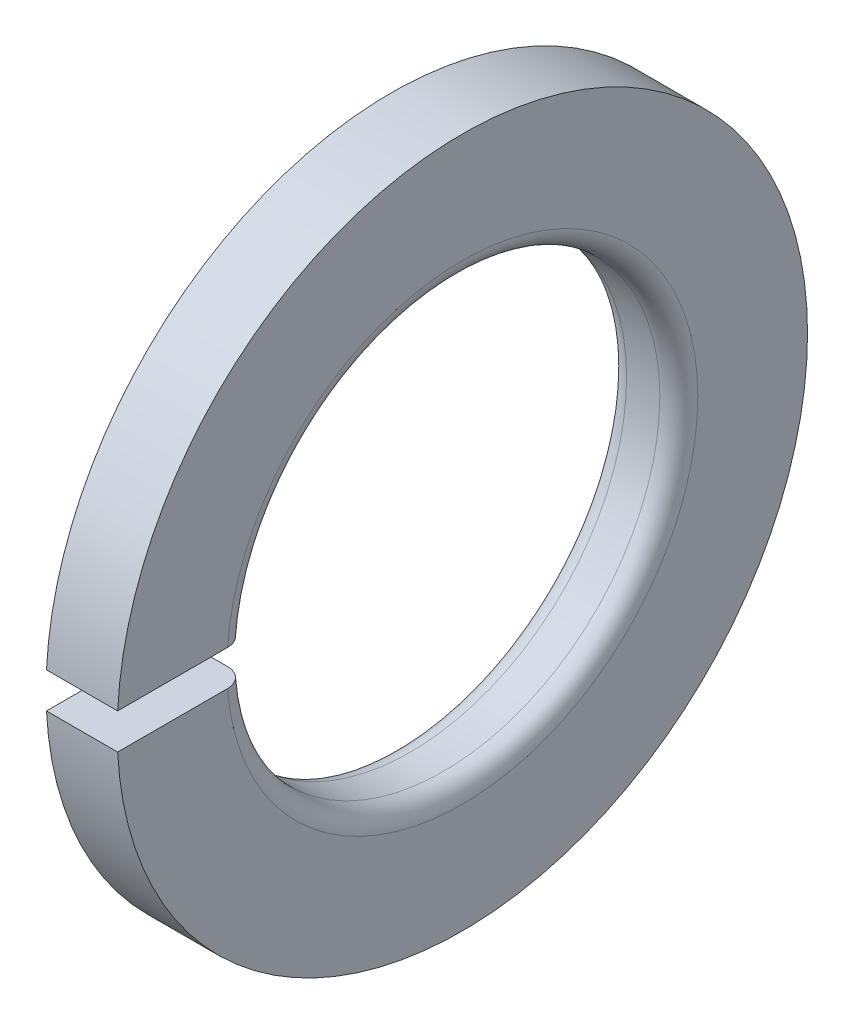
ISO-10303-21;
HEADER;
FILE_DESCRIPTION(('STEP AP214'),'2;1');
FILE_NAME('part.step','',(''),(''),'','','');
FILE_SCHEMA(('AUTOMOTIVE_DESIGN { 1 0 10303 214 1 1 1 1 }'));
ENDSEC;
DATA;
#1=APPLICATION_CONTEXT('core data for automotive mechanical design processes');
#2=APPLICATION_PROTOCOL_DEFINITION('international standard','automotive_design',2000,#1);
#3=PRODUCT_CONTEXT('',#1,'mechanical');
#4=PRODUCT('Part','Part','',(#3));
#5=PRODUCT_RELATED_PRODUCT_CATEGORY('part','',(#4));
#6=PRODUCT_DEFINITION_FORMATION('','',#4);
#7=PRODUCT_DEFINITION_CONTEXT('part definition',#1,'design');
#8=PRODUCT_DEFINITION('design','',#6,#7);
#9=PRODUCT_DEFINITION_SHAPE('','',#8);
#10=(LENGTH_UNIT() NAMED_UNIT(*) SI_UNIT(.MILLI.,.METRE.));
#11=(NAMED_UNIT(*) PLANE_ANGLE_UNIT() SI_UNIT($,.RADIAN.));
#12=(NAMED_UNIT(*) SI_UNIT($,.STERADIAN.) SOLID_ANGLE_UNIT());
#13=UNCERTAINTY_MEASURE_WITH_UNIT(LENGTH_MEASURE(1.E-05),#10,'distance_accuracy_value','');
#14=(GEOMETRIC_REPRESENTATION_CONTEXT(3) GLOBAL_UNCERTAINTY_ASSIGNED_CONTEXT((#13)) GLOBAL_UNIT_ASSIGNED_CONTEXT((#10,
#11,#12)) REPRESENTATION_CONTEXT('',''));
#15=CARTESIAN_POINT('',(0.,0.,0.));
#16=DIRECTION('',(0.,0.,1.));
#17=DIRECTION('',(1.,0.,0.));
#18=AXIS2_PLACEMENT_3D('',#15,#16,#17);
#19=CARTESIAN_POINT('',(-34.9249999999999,0.,0.));
#20=DIRECTION('',(-1.,0.,0.));
#21=DIRECTION('',(0.,0.,1.));
#22=AXIS2_PLACEMENT_3D('',#19,#20,#21);
#23=CYLINDRICAL_SURFACE('',#22,29.1);
#24=DIRECTION('',(-1.,0.,0.));
#25=VECTOR('',#24,1.);
#26=CARTESIAN_POINT('',(-34.9249999999999,1.5,29.0613144919496));
#27=LINE('',#26,#25);
#28=CARTESIAN_POINT('',(0.,1.5,29.0613144919496));
#29=VERTEX_POINT('',#28);
#30=CARTESIAN_POINT('',(-6.,1.5,29.0613144919496));
#31=VERTEX_POINT('',#30);
#32=EDGE_CURVE('E45',#29,#31,#27,.T.);
#33=ORIENTED_EDGE('',*,*,#32,.F.);
#34=CARTESIAN_POINT('',(0.,0.,0.));
#35=DIRECTION('',(-1.,0.,0.));
#36=DIRECTION('',(0.,0.,1.));
#37=AXIS2_PLACEMENT_3D('',#34,#35,#36);
#38=CIRCLE('',#37,29.1);
#39=CARTESIAN_POINT('',(0.,-1.5,29.0613144919496));
#40=VERTEX_POINT('',#39);
#41=EDGE_CURVE('E106',#29,#40,#38,.T.);
#42=ORIENTED_EDGE('',*,*,#41,.T.);
#43=DIRECTION('',(-1.,0.,0.));
#44=VECTOR('',#43,1.);
#45=CARTESIAN_POINT('',(-34.9249999999999,-1.5,29.0613144919496));
#46=LINE('',#45,#44);
#47=CARTESIAN_POINT('',(-6.,-1.5,29.0613144919496));
#48=VERTEX_POINT('',#47);
#49=EDGE_CURVE('E87',#48,#40,#46,.F.);
#50=ORIENTED_EDGE('',*,*,#49,.F.);
#51=CARTESIAN_POINT('',(-6.,0.,0.));
#52=DIRECTION('',(-1.,0.,0.));
#53=DIRECTION('',(0.,0.,1.));
#54=AXIS2_PLACEMENT_3D('',#51,#52,#53);
#55=CIRCLE('',#54,29.1);
#56=EDGE_CURVE('E118',#31,#48,#55,.T.);
#57=ORIENTED_EDGE('',*,*,#56,.F.);
#58=EDGE_LOOP('',(#33,#42,#50,#57));
#59=FACE_BOUND('',#58,.T.);
#60=ADVANCED_FACE('F32',(#59),#23,.T.);
#61=CARTESIAN_POINT('',(0.,19.85,0.));
#62=DIRECTION('',(-1.,0.,0.));
#63=DIRECTION('',(0.,0.,1.));
#64=AXIS2_PLACEMENT_3D('',#61,#62,#63);
#65=PLANE('',#64);
#66=DIRECTION('',(0.,0.,-1.));
#67=VECTOR('',#66,1.);
#68=CARTESIAN_POINT('',(0.,1.5,29.682));
#69=LINE('',#68,#67);
#70=CARTESIAN_POINT('',(0.,1.5,19.7932437968111));
#71=VERTEX_POINT('',#70);
#72=EDGE_CURVE('E92',#29,#71,#69,.T.);
#73=ORIENTED_EDGE('',*,*,#72,.T.);
#74=CARTESIAN_POINT('',(0.,0.,0.));
#75=DIRECTION('',(-1.,0.,0.));
#76=DIRECTION('',(0.,0.,1.));
#77=AXIS2_PLACEMENT_3D('',#74,#75,#76);
#78=CIRCLE('',#77,19.85);
#79=CARTESIAN_POINT('',(0.,-1.5,19.7932437968111));
#80=VERTEX_POINT('',#79);
#81=EDGE_CURVE('E99',#71,#80,#78,.T.);
#82=ORIENTED_EDGE('',*,*,#81,.T.);
#83=DIRECTION('',(0.,0.,1.));
#84=VECTOR('',#83,1.);
#85=CARTESIAN_POINT('',(0.,-1.5,0.));
#86=LINE('',#85,#84);
#87=EDGE_CURVE('E81',#80,#40,#86,.T.);
#88=ORIENTED_EDGE('',*,*,#87,.T.);
#89=ORIENTED_EDGE('',*,*,#41,.F.);
#90=EDGE_LOOP('',(#73,#82,#88,#89));
#91=FACE_BOUND('',#90,.T.);
#92=ADVANCED_FACE('F105',(#91),#65,.F.);
#93=CARTESIAN_POINT('',(-1.6,0.,0.));
#94=DIRECTION('',(-1.,0.,0.));
#95=DIRECTION('',(0.,0.,1.));
#96=AXIS2_PLACEMENT_3D('',#93,#94,#95);
#97=TOROIDAL_SURFACE('',#96,19.85,1.6);
#98=ORIENTED_EDGE('',*,*,#81,.F.);
#99=CARTESIAN_POINT('',(-1.35898862941232,1.5,18.2065697970712));
#100=CARTESIAN_POINT('',(-1.44756264219889,1.5,18.1930320440047));
#101=CARTESIAN_POINT('',(-1.53734436705855,1.5,18.1869657742528));
#102=CARTESIAN_POINT('',(-1.71672508267117,1.5,18.1899960073179));
#103=CARTESIAN_POINT('',(-1.80632372802799,1.5,18.1991105931413));
#104=CARTESIAN_POINT('',(-1.98267978527209,1.5,18.2322522732383));
#105=CARTESIAN_POINT('',(-2.06943862751872,1.5,18.2562717346096));
#106=CARTESIAN_POINT('',(-2.23767395505805,1.5,18.3185162662278));
#107=CARTESIAN_POINT('',(-2.31915170666891,1.5,18.356737916115));
#108=CARTESIAN_POINT('',(-2.47463573194463,1.5,18.4463332782058));
#109=CARTESIAN_POINT('',(-2.54863414894016,1.5,18.4977206241443));
#110=CARTESIAN_POINT('',(-2.68698778072629,1.5,18.6121581582613));
#111=CARTESIAN_POINT('',(-2.75134249542695,1.5,18.6752089508883));
#112=CARTESIAN_POINT('',(-2.86877662072559,1.5,18.8113725098221));
#113=CARTESIAN_POINT('',(-2.92182337797574,1.5,18.8845134372985));
#114=CARTESIAN_POINT('',(-3.01492839338455,1.5,19.0386410098248));
#115=CARTESIAN_POINT('',(-3.0549864516518,1.5,19.1196277755945));
#116=CARTESIAN_POINT('',(-3.12109977190569,1.5,19.2874120717265));
#117=CARTESIAN_POINT('',(-3.14711232451801,1.5,19.3742264327302));
#118=CARTESIAN_POINT('',(-3.18422209141426,1.5,19.5509866443176));
#119=CARTESIAN_POINT('',(-3.19531915789572,1.5,19.6409325259236));
#120=CARTESIAN_POINT('',(-3.20229183118463,1.5,19.8215710344792));
#121=CARTESIAN_POINT('',(-3.19814073119644,1.5,19.9122646937714));
#122=CARTESIAN_POINT('',(-3.17466942665468,1.5,20.091668060745));
#123=CARTESIAN_POINT('',(-3.1553491780564,1.5,20.1803777626651));
#124=CARTESIAN_POINT('',(-3.10208087640931,1.5,20.3532768185581));
#125=CARTESIAN_POINT('',(-3.06813506328876,1.5,20.4374668625043));
#126=CARTESIAN_POINT('',(-2.9865665247085,1.5,20.5989385297249));
#127=CARTESIAN_POINT('',(-2.93894390974055,1.5,20.676220208804));
#128=CARTESIAN_POINT('',(-2.83145952958272,1.5,20.8215313866775));
#129=CARTESIAN_POINT('',(-2.77161962727461,1.5,20.8895770561764));
#130=CARTESIAN_POINT('',(-2.64133933557313,1.5,21.014624888216));
#131=CARTESIAN_POINT('',(-2.57089908394285,1.5,21.0716271942552));
#132=CARTESIAN_POINT('',(-2.42160768621288,1.5,21.1728176319717));
#133=CARTESIAN_POINT('',(-2.34277815834402,1.5,21.2170376583009));
#134=CARTESIAN_POINT('',(-2.17880174150641,1.5,21.2915813400076));
#135=CARTESIAN_POINT('',(-2.09365493574573,1.5,21.3219051783811));
#136=CARTESIAN_POINT('',(-1.9196662955211,1.5,21.3677292166293));
#137=CARTESIAN_POINT('',(-1.83083316821152,1.5,21.3832624803174));
#138=CARTESIAN_POINT('',(-1.65182011224298,1.5,21.3991754498783));
#139=CARTESIAN_POINT('',(-1.5616401948385,1.5,21.3995552823101));
#140=CARTESIAN_POINT('',(-1.38260446434317,1.5,21.38515912134));
#141=CARTESIAN_POINT('',(-1.29374723391222,1.5,21.3704007452365));
#142=CARTESIAN_POINT('',(-1.11977076978006,1.5,21.326179749964));
#143=CARTESIAN_POINT('',(-1.0346515322168,1.5,21.2967171459877));
#144=CARTESIAN_POINT('',(-0.87053613982388,1.5,21.2239224595834));
#145=CARTESIAN_POINT('',(-0.791541834195377,1.5,21.1805862086086));
#146=CARTESIAN_POINT('',(-0.641934076647546,1.5,21.0812876423963));
#147=CARTESIAN_POINT('',(-0.57132068604379,1.5,21.0253252347933));
#148=CARTESIAN_POINT('',(-0.440349901223056,1.5,20.9022674852953));
#149=CARTESIAN_POINT('',(-0.38000975893144,1.5,20.8351537831413));
#150=CARTESIAN_POINT('',(-0.271420338049165,1.5,20.6917701667164));
#151=CARTESIAN_POINT('',(-0.22317119834632,1.5,20.6155001472828));
#152=CARTESIAN_POINT('',(-0.140006443732164,1.5,20.4557686412415));
#153=CARTESIAN_POINT('',(-0.105123913631718,1.5,20.3722899290199));
#154=CARTESIAN_POINT('',(-0.0498316399833283,1.5,20.2006695798564));
#155=CARTESIAN_POINT('',(-0.029422123933152,1.5,20.1125278696414));
#156=CARTESIAN_POINT('',(-0.00361029931817148,1.5,19.9338623377287));
#157=CARTESIAN_POINT('',(0.00175670724642623,1.5,19.8433334149511));
#158=CARTESIAN_POINT('',(-0.00276354879845688,1.5,19.6626566676938));
#159=CARTESIAN_POINT('',(-0.0126509853949023,1.5,19.5725088475725));
#160=CARTESIAN_POINT('',(-0.0474234873886119,1.5,19.3950362522409));
#161=CARTESIAN_POINT('',(-0.0723272144995143,1.5,19.3077151324688));
#162=CARTESIAN_POINT('',(-0.136448616705549,1.5,19.1384998728598));
#163=CARTESIAN_POINT('',(-0.175665733574809,1.5,19.0566055215247));
#164=CARTESIAN_POINT('',(-0.267279982419321,1.5,18.9006318707112));
#165=CARTESIAN_POINT('',(-0.319667817885635,1.5,18.8265471109892));
#166=CARTESIAN_POINT('',(-0.43618078430084,1.5,18.6882315830034));
#167=CARTESIAN_POINT('',(-0.500308705570106,1.5,18.6240031640269));
#168=CARTESIAN_POINT('',(-0.638334807094057,1.5,18.5073897056886));
#169=CARTESIAN_POINT('',(-0.71221416670987,1.5,18.4549823660662));
#170=CARTESIAN_POINT('',(-0.867689377618268,1.5,18.3634172873524));
#171=CARTESIAN_POINT('',(-0.949275652140454,1.5,18.3242433742089));
#172=CARTESIAN_POINT('',(-1.0860658761961,1.5,18.2722771118594));
#173=CARTESIAN_POINT('',(-1.13964885389551,1.5,18.2551041086582));
#174=CARTESIAN_POINT('',(-1.24832564735517,1.5,18.2264970835713));
#175=CARTESIAN_POINT('',(-1.30341946060914,1.5,18.215063052166));
#176=CARTESIAN_POINT('',(-1.35898862941232,1.5,18.2065697970712));
#177=B_SPLINE_CURVE_WITH_KNOTS('',3,(#99,#100,#101,#102,#103,#104,#105,#106,#107,#108,#109,#110,
#111,#112,#113,#114,#115,#116,#117,#118,#119,#120,#121,#122,#123,#124,#125,#126,#127,#128,#129,
#130,#131,#132,#133,#134,#135,#136,#137,#138,#139,#140,#141,#142,#143,#144,#145,#146,#147,#148,
#149,#150,#151,#152,#153,#154,#155,#156,#157,#158,#159,#160,#161,#162,#163,#164,#165,#166,#167,
#168,#169,#170,#171,#172,#173,#174,#175,#176),.UNSPECIFIED.,.T.,.F.,(4,2,2,2,2,2,2,2,2,2,2,2,2,
2,2,2,2,2,2,2,2,2,2,2,2,2,2,2,2,2,2,2,2,2,2,2,2,2,4),(0.,0.268602518172523,0.537525216954459,
0.806310311862341,1.07503071628382,1.34403052683165,1.61304428198022,1.8828246341334,
2.15260913791189,2.42320944359887,2.69381243073406,2.96488959828007,3.23596755292079,
3.50700400629479,3.77803827008875,4.04859170255715,4.31914161919272,4.58901050767115,
4.85887584220014,5.12813647597752,5.39739486093241,5.66634024786311,5.93528535691632,
6.20431135055502,6.47333931229222,6.74281469104966,7.01229316509477,7.28243440438609,
7.55257988986734,7.82335882834509,8.09414085525769,8.36526009606448,8.63636876428099,
8.90728660596402,9.17826892173335,9.4487356771476,9.71887065863252,9.88738558713909,
10.055900236117),.UNSPECIFIED.);
#178=CARTESIAN_POINT('',(-1.60000000000001,1.5,18.1882517026788));
#179=VERTEX_POINT('',#178);
#180=EDGE_CURVE('E125',#71,#179,#177,.T.);
#181=ORIENTED_EDGE('',*,*,#180,.T.);
#182=CARTESIAN_POINT('',(-1.60000000000001,0.,0.));
#183=DIRECTION('',(-1.,0.,0.));
#184=DIRECTION('',(0.,0.,1.));
#185=AXIS2_PLACEMENT_3D('',#182,#183,#184);
#186=CIRCLE('',#185,18.25);
#187=CARTESIAN_POINT('',(-1.60000000000001,-1.5,18.1882517026788));
#188=VERTEX_POINT('',#187);
#189=EDGE_CURVE('E101',#179,#188,#186,.T.);
#190=ORIENTED_EDGE('',*,*,#189,.T.);
#191=CARTESIAN_POINT('',(-1.35898862941232,-1.5,18.2065697970712));
#192=CARTESIAN_POINT('',(-1.2702828615628,-1.5,18.2201358448888));
#193=CARTESIAN_POINT('',(-1.18265946886249,-1.5,18.2412156275596));
#194=CARTESIAN_POINT('',(-1.01212827608701,-1.5,18.2978180851211));
#195=CARTESIAN_POINT('',(-0.929226351107397,-1.5,18.3333583245978));
#196=CARTESIAN_POINT('',(-0.770605511619332,-1.5,18.4178303806316));
#197=CARTESIAN_POINT('',(-0.69488241464164,-1.5,18.46675433431));
#198=CARTESIAN_POINT('',(-0.552724592282634,-1.5,18.5765829245361));
#199=CARTESIAN_POINT('',(-0.486287620565732,-1.5,18.6374846550213));
#200=CARTESIAN_POINT('',(-0.364403298808446,-1.5,18.7696823748797));
#201=CARTESIAN_POINT('',(-0.308979824689325,-1.5,18.8410003774852));
#202=CARTESIAN_POINT('',(-0.210846965099342,-1.5,18.9919080063849));
#203=CARTESIAN_POINT('',(-0.168138285374553,-1.5,19.0714980914977));
#204=CARTESIAN_POINT('',(-0.0965161618207194,-1.5,19.236950753855));
#205=CARTESIAN_POINT('',(-0.0676453537648036,-1.5,19.3228317889129));
#206=CARTESIAN_POINT('',(-0.0247004216836366,-1.5,19.4982170639294));
#207=CARTESIAN_POINT('',(-0.010626458247275,-1.5,19.5877213431999));
#208=CARTESIAN_POINT('',(0.00234250759080364,-1.5,19.7679967466625));
#209=CARTESIAN_POINT('',(0.00120826968800519,-1.5,19.8587699759636));
#210=CARTESIAN_POINT('',(-0.0162824537952204,-1.5,20.0388381712476));
#211=CARTESIAN_POINT('',(-0.0326389544735772,-1.5,20.1281331357643));
#212=CARTESIAN_POINT('',(-0.0801212105075573,-1.5,20.3027102833833));
#213=CARTESIAN_POINT('',(-0.111247501407328,-1.5,20.3879923208559));
#214=CARTESIAN_POINT('',(-0.187399044362751,-1.5,20.5521078274884));
#215=CARTESIAN_POINT('',(-0.232424215877482,-1.5,20.6309413340127));
#216=CARTESIAN_POINT('',(-0.335021098728203,-1.5,20.7797793165647));
#217=CARTESIAN_POINT('',(-0.392572016464512,-1.5,20.8497981250976));
#218=CARTESIAN_POINT('',(-0.518638804642939,-1.5,20.9791497299572));
#219=CARTESIAN_POINT('',(-0.587154529943274,-1.5,21.0384826677115));
#220=CARTESIAN_POINT('',(-0.733023483226778,-1.5,21.1446206659053));
#221=CARTESIAN_POINT('',(-0.810354280534633,-1.5,21.1914565535414));
#222=CARTESIAN_POINT('',(-0.971795255738864,-1.5,21.2714458829956));
#223=CARTESIAN_POINT('',(-1.05590534394941,-1.5,21.3045995057863));
#224=CARTESIAN_POINT('',(-1.22830821167201,-1.5,21.3562070318146));
#225=CARTESIAN_POINT('',(-1.31659088372152,-1.5,21.3746947037559));
#226=CARTESIAN_POINT('',(-1.49500758649364,-1.5,21.3965648748582));
#227=CARTESIAN_POINT('',(-1.58514160041917,-1.5,21.3999475110051));
#228=CARTESIAN_POINT('',(-1.76457850690134,-1.5,21.3915157945795));
#229=CARTESIAN_POINT('',(-1.85388232375839,-1.5,21.379721094972));
#230=CARTESIAN_POINT('',(-2.02924237233441,-1.5,21.3413081635649));
#231=CARTESIAN_POINT('',(-2.11529860941422,-1.5,21.3146899562359));
#232=CARTESIAN_POINT('',(-2.28173832888175,-1.5,21.247389411192));
#233=CARTESIAN_POINT('',(-2.36212094053299,-1.5,21.2067049203384));
#234=CARTESIAN_POINT('',(-2.51492892830416,-1.5,21.1124381826377));
#235=CARTESIAN_POINT('',(-2.58735425617491,-1.5,21.0588558575905));
#236=CARTESIAN_POINT('',(-2.72231551219307,-1.5,20.9402303476218));
#237=CARTESIAN_POINT('',(-2.7848359735773,-1.5,20.8751695670898));
#238=CARTESIAN_POINT('',(-2.89809849014268,-1.5,20.7354972074255));
#239=CARTESIAN_POINT('',(-2.94884039728093,-1.5,20.6608855082674));
#240=CARTESIAN_POINT('',(-3.03723708013841,-1.5,20.5040370158402));
#241=CARTESIAN_POINT('',(-3.07485991682572,-1.5,20.4217822225949));
#242=CARTESIAN_POINT('',(-3.13579979332443,-1.5,20.2521340136867));
#243=CARTESIAN_POINT('',(-3.15911664848707,-1.5,20.1647405317143));
#244=CARTESIAN_POINT('',(-3.19083712295782,-1.5,19.9870705998533));
#245=CARTESIAN_POINT('',(-3.19920476688805,-1.5,19.8967877261449));
#246=CARTESIAN_POINT('',(-3.2006869814804,-1.5,19.7160963617466));
#247=CARTESIAN_POINT('',(-3.19380136793254,-1.5,19.6256878695527));
#248=CARTESIAN_POINT('',(-3.16495187673286,-1.5,19.4471811393607));
#249=CARTESIAN_POINT('',(-3.14296727694056,-1.5,19.3590862493232));
#250=CARTESIAN_POINT('',(-3.08451471803245,-1.5,19.1878392676738));
#251=CARTESIAN_POINT('',(-3.04804671518917,-1.5,19.1046871909857));
#252=CARTESIAN_POINT('',(-2.96166734063066,-1.5,18.9457270839862));
#253=CARTESIAN_POINT('',(-2.91176117687551,-1.5,18.8699162240285));
#254=CARTESIAN_POINT('',(-2.79990487081647,-1.5,18.727775943562));
#255=CARTESIAN_POINT('',(-2.73795532255682,-1.5,18.6614460556808));
#256=CARTESIAN_POINT('',(-2.60392079867125,-1.5,18.5403172974112));
#257=CARTESIAN_POINT('',(-2.53185988272459,-1.5,18.4854918037973));
#258=CARTESIAN_POINT('',(-2.37951170949177,-1.5,18.3887486394602));
#259=CARTESIAN_POINT('',(-2.29922254516656,-1.5,18.3468339701017));
#260=CARTESIAN_POINT('',(-2.13295593837108,-1.5,18.2772428812663));
#261=CARTESIAN_POINT('',(-2.04699428657167,-1.5,18.2495286743792));
#262=CARTESIAN_POINT('',(-1.87170264872835,-1.5,18.2090029826223));
#263=CARTESIAN_POINT('',(-1.78237692815419,-1.5,18.1961732409649));
#264=CARTESIAN_POINT('',(-1.63697486679475,-1.5,18.1877018316832));
#265=CARTESIAN_POINT('',(-1.58112973774576,-1.5,18.1873883515051));
#266=CARTESIAN_POINT('',(-1.46971314242031,-1.5,18.1926049769725));
#267=CARTESIAN_POINT('',(-1.41414167559521,-1.5,18.1981350708979));
#268=CARTESIAN_POINT('',(-1.35898862941232,-1.5,18.2065697970712));
#269=B_SPLINE_CURVE_WITH_KNOTS('',3,(#191,#192,#193,#194,#195,#196,#197,#198,#199,#200,#201,
#202,#203,#204,#205,#206,#207,#208,#209,#210,#211,#212,#213,#214,#215,#216,#217,#218,#219,#220,
#221,#222,#223,#224,#225,#226,#227,#228,#229,#230,#231,#232,#233,#234,#235,#236,#237,#238,#239,
#240,#241,#242,#243,#244,#245,#246,#247,#248,#249,#250,#251,#252,#253,#254,#255,#256,#257,#258,
#259,#260,#261,#262,#263,#264,#265,#266,#267,#268),.UNSPECIFIED.,.T.,.F.,(4,2,2,2,2,2,2,2,2,2,2,
2,2,2,2,2,2,2,2,2,2,2,2,2,2,2,2,2,2,2,2,2,2,2,2,2,2,2,4),(0.,0.269007109983916,0.53834195316348,
0.80751890176209,1.076630622711,1.34631952873907,1.61602340130217,1.88655299835131,
2.15708553140472,2.42813828285402,2.69919130314245,2.97025415240949,3.24131543095711,
3.5119301154336,3.78254121806431,4.05247848462414,4.32241218066663,4.59172252912069,
4.86103043522238,5.12998996814843,5.3989490570785,5.66794933405682,5.93695124203439,
6.20636915054589,6.47579044514766,6.74586315344102,7.01593934751706,7.28666461073962,
7.55739314346495,7.82849397368381,8.09959562240146,8.37059235650057,8.64157572697872,
8.91192490362075,9.18233688068072,9.45202550536377,9.72138298809129,9.88863920690257,
10.0558950902589),.UNSPECIFIED.);
#270=EDGE_CURVE('E84',#188,#80,#269,.T.);
#271=ORIENTED_EDGE('',*,*,#270,.T.);
#272=EDGE_LOOP('',(#98,#181,#190,#271));
#273=FACE_BOUND('',#272,.T.);
#274=ADVANCED_FACE('F97',(#273),#97,.T.);
#275=CARTESIAN_POINT('',(-34.9249999999999,0.,0.));
#276=DIRECTION('',(-1.,0.,0.));
#277=DIRECTION('',(0.,0.,1.));
#278=AXIS2_PLACEMENT_3D('',#275,#276,#277);
#279=CYLINDRICAL_SURFACE('',#278,18.25);
#280=DIRECTION('',(-1.,0.,0.));
#281=VECTOR('',#280,1.);
#282=CARTESIAN_POINT('',(-34.9249999999999,1.5,18.1882517026788));
#283=LINE('',#282,#281);
#284=CARTESIAN_POINT('',(-4.39999999999999,1.5,18.1882517026788));
#285=VERTEX_POINT('',#284);
#286=EDGE_CURVE('E133',#285,#179,#283,.F.);
#287=ORIENTED_EDGE('',*,*,#286,.F.);
#288=CARTESIAN_POINT('',(-4.39999999999999,0.,0.));
#289=DIRECTION('',(-1.,0.,0.));
#290=DIRECTION('',(0.,0.,1.));
#291=AXIS2_PLACEMENT_3D('',#288,#289,#290);
#292=CIRCLE('',#291,18.25);
#293=CARTESIAN_POINT('',(-4.39999999999999,-1.5,18.1882517026788));
#294=VERTEX_POINT('',#293);
#295=EDGE_CURVE('E109',#285,#294,#292,.T.);
#296=ORIENTED_EDGE('',*,*,#295,.T.);
#297=DIRECTION('',(-1.,0.,0.));
#298=VECTOR('',#297,1.);
#299=CARTESIAN_POINT('',(-34.9249999999999,-1.5,18.1882517026788));
#300=LINE('',#299,#298);
#301=EDGE_CURVE('E102',#188,#294,#300,.T.);
#302=ORIENTED_EDGE('',*,*,#301,.F.);
#303=ORIENTED_EDGE('',*,*,#189,.F.);
#304=EDGE_LOOP('',(#287,#296,#302,#303));
#305=FACE_BOUND('',#304,.T.);
#306=ADVANCED_FACE('F132',(#305),#279,.F.);
#307=CARTESIAN_POINT('',(-4.4,0.,0.));
#308=DIRECTION('',(-1.,0.,0.));
#309=DIRECTION('',(0.,0.,1.));
#310=AXIS2_PLACEMENT_3D('',#307,#308,#309);
#311=TOROIDAL_SURFACE('',#310,19.85,1.6);
#312=ORIENTED_EDGE('',*,*,#295,.F.);
#313=CARTESIAN_POINT('',(-4.64101137058768,1.5,18.2065697970712));
#314=CARTESIAN_POINT('',(-4.7297171384372,1.5,18.2201358448888));
#315=CARTESIAN_POINT('',(-4.81734053113751,1.5,18.2412156275595));
#316=CARTESIAN_POINT('',(-4.98787172391299,1.5,18.2978180851211));
#317=CARTESIAN_POINT('',(-5.0707736488926,1.5,18.3333583245978));
#318=CARTESIAN_POINT('',(-5.22939448838067,1.5,18.4178303806316));
#319=CARTESIAN_POINT('',(-5.30511758535836,1.5,18.46675433431));
#320=CARTESIAN_POINT('',(-5.44727540771737,1.5,18.5765829245361));
#321=CARTESIAN_POINT('',(-5.51371237943427,1.5,18.6374846550213));
#322=CARTESIAN_POINT('',(-5.63559670119155,1.5,18.7696823748797));
#323=CARTESIAN_POINT('',(-5.69102017531067,1.5,18.8410003774852));
#324=CARTESIAN_POINT('',(-5.78915303490066,1.5,18.9919080063849));
#325=CARTESIAN_POINT('',(-5.83186171462545,1.5,19.0714980914977));
#326=CARTESIAN_POINT('',(-5.90348383817928,1.5,19.236950753855));
#327=CARTESIAN_POINT('',(-5.93235464623519,1.5,19.3228317889129));
#328=CARTESIAN_POINT('',(-5.97529957831636,1.5,19.4982170639294));
#329=CARTESIAN_POINT('',(-5.98937354175272,1.5,19.5877213431999));
#330=CARTESIAN_POINT('',(-6.0023425075908,1.5,19.7679967466625));
#331=CARTESIAN_POINT('',(-6.001208269688,1.5,19.8587699759636));
#332=CARTESIAN_POINT('',(-5.98371754620478,1.5,20.0388381712476));
#333=CARTESIAN_POINT('',(-5.96736104552642,1.5,20.1281331357643));
#334=CARTESIAN_POINT('',(-5.91987878949244,1.5,20.3027102833833));
#335=CARTESIAN_POINT('',(-5.88875249859267,1.5,20.3879923208559));
#336=CARTESIAN_POINT('',(-5.81260095563725,1.5,20.5521078274884));
#337=CARTESIAN_POINT('',(-5.76757578412252,1.5,20.6309413340127));
#338=CARTESIAN_POINT('',(-5.6649789012718,1.5,20.7797793165647));
#339=CARTESIAN_POINT('',(-5.60742798353549,1.5,20.8497981250976));
#340=CARTESIAN_POINT('',(-5.48136119535706,1.5,20.9791497299572));
#341=CARTESIAN_POINT('',(-5.41284547005672,1.5,21.0384826677115));
#342=CARTESIAN_POINT('',(-5.26697651677322,1.5,21.1446206659053));
#343=CARTESIAN_POINT('',(-5.18964571946537,1.5,21.1914565535414));
#344=CARTESIAN_POINT('',(-5.02820474426113,1.5,21.2714458829956));
#345=CARTESIAN_POINT('',(-4.94409465605059,1.5,21.3045995057863));
#346=CARTESIAN_POINT('',(-4.77169178832799,1.5,21.3562070318146));
#347=CARTESIAN_POINT('',(-4.68340911627848,1.5,21.3746947037559));
#348=CARTESIAN_POINT('',(-4.50499241350636,1.5,21.3965648748582));
#349=CARTESIAN_POINT('',(-4.41485839958083,1.5,21.3999475110051));
#350=CARTESIAN_POINT('',(-4.23542149309866,1.5,21.3915157945795));
#351=CARTESIAN_POINT('',(-4.1461176762416,1.5,21.379721094972));
#352=CARTESIAN_POINT('',(-3.97075762766558,1.5,21.3413081635649));
#353=CARTESIAN_POINT('',(-3.88470139058578,1.5,21.3146899562359));
#354=CARTESIAN_POINT('',(-3.71826167111824,1.5,21.247389411192));
#355=CARTESIAN_POINT('',(-3.63787905946701,1.5,21.2067049203384));
#356=CARTESIAN_POINT('',(-3.48507107169584,1.5,21.1124381826377));
#357=CARTESIAN_POINT('',(-3.41264574382509,1.5,21.0588558575905));
#358=CARTESIAN_POINT('',(-3.27768448780693,1.5,20.9402303476218));
#359=CARTESIAN_POINT('',(-3.21516402642269,1.5,20.8751695670898));
#360=CARTESIAN_POINT('',(-3.10190150985732,1.5,20.7354972074255));
#361=CARTESIAN_POINT('',(-3.05115960271907,1.5,20.6608855082674));
#362=CARTESIAN_POINT('',(-2.96276291986159,1.5,20.5040370158402));
#363=CARTESIAN_POINT('',(-2.92514008317428,1.5,20.4217822225949));
#364=CARTESIAN_POINT('',(-2.86420020667557,1.5,20.2521340136867));
#365=CARTESIAN_POINT('',(-2.84088335151292,1.5,20.1647405317143));
#366=CARTESIAN_POINT('',(-2.80916287704218,1.5,19.9870705998533));
#367=CARTESIAN_POINT('',(-2.80079523311195,1.5,19.8967877261449));
#368=CARTESIAN_POINT('',(-2.7993130185196,1.5,19.7160963617466));
#369=CARTESIAN_POINT('',(-2.80619863206746,1.5,19.6256878695527));
#370=CARTESIAN_POINT('',(-2.83504812326713,1.5,19.4471811393607));
#371=CARTESIAN_POINT('',(-2.85703272305944,1.5,19.3590862493232));
#372=CARTESIAN_POINT('',(-2.91548528196754,1.5,19.1878392676738));
#373=CARTESIAN_POINT('',(-2.95195328481083,1.5,19.1046871909857));
#374=CARTESIAN_POINT('',(-3.03833265936934,1.5,18.9457270839862));
#375=CARTESIAN_POINT('',(-3.08823882312449,1.5,18.8699162240285));
#376=CARTESIAN_POINT('',(-3.20009512918353,1.5,18.727775943562));
#377=CARTESIAN_POINT('',(-3.26204467744318,1.5,18.6614460556808));
#378=CARTESIAN_POINT('',(-3.39607920132875,1.5,18.5403172974112));
#379=CARTESIAN_POINT('',(-3.46814011727541,1.5,18.4854918037973));
#380=CARTESIAN_POINT('',(-3.62048829050822,1.5,18.3887486394602));
#381=CARTESIAN_POINT('',(-3.70077745483344,1.5,18.3468339701017));
#382=CARTESIAN_POINT('',(-3.86704406162892,1.5,18.2772428812663));
#383=CARTESIAN_POINT('',(-3.95300571342833,1.5,18.2495286743792));
#384=CARTESIAN_POINT('',(-4.12829735127165,1.5,18.2090029826223));
#385=CARTESIAN_POINT('',(-4.21762307184581,1.5,18.1961732409649));
#386=CARTESIAN_POINT('',(-4.36302513320525,1.5,18.1877018316832));
#387=CARTESIAN_POINT('',(-4.41887026225424,1.5,18.1873883515051));
#388=CARTESIAN_POINT('',(-4.53028685757968,1.5,18.1926049769725));
#389=CARTESIAN_POINT('',(-4.58585832440478,1.5,18.1981350708979));
#390=CARTESIAN_POINT('',(-4.64101137058768,1.5,18.2065697970712));
#391=B_SPLINE_CURVE_WITH_KNOTS('',3,(#313,#314,#315,#316,#317,#318,#319,#320,#321,#322,#323,
#324,#325,#326,#327,#328,#329,#330,#331,#332,#333,#334,#335,#336,#337,#338,#339,#340,#341,#342,
#343,#344,#345,#346,#347,#348,#349,#350,#351,#352,#353,#354,#355,#356,#357,#358,#359,#360,#361,
#362,#363,#364,#365,#366,#367,#368,#369,#370,#371,#372,#373,#374,#375,#376,#377,#378,#379,#380,
#381,#382,#383,#384,#385,#386,#387,#388,#389,#390),.UNSPECIFIED.,.T.,.F.,(4,2,2,2,2,2,2,2,2,2,2,
2,2,2,2,2,2,2,2,2,2,2,2,2,2,2,2,2,2,2,2,2,2,2,2,2,2,2,4),(0.,0.269007109983917,0.53834195316348,
0.80751890176209,1.076630622711,1.34631952873908,1.61602340130217,1.88655299835131,
2.15708553140473,2.42813828285402,2.69919130314245,2.97025415240949,3.24131543095711,
3.5119301154336,3.78254121806431,4.05247848462414,4.32241218066663,4.59172252912069,
4.86103043522238,5.12998996814843,5.3989490570785,5.66794933405682,5.93695124203439,
6.20636915054589,6.47579044514766,6.74586315344102,7.01593934751706,7.28666461073962,
7.55739314346495,7.82849397368381,8.09959562240146,8.37059235650057,8.64157572697872,
8.91192490362075,9.18233688068072,9.45202550536377,9.72138298809129,9.88863920690257,
10.0558950902589),.UNSPECIFIED.);
#392=CARTESIAN_POINT('',(-6.,1.5,19.7932437968111));
#393=VERTEX_POINT('',#392);
#394=EDGE_CURVE('E119',#285,#393,#391,.T.);
#395=ORIENTED_EDGE('',*,*,#394,.T.);
#396=CARTESIAN_POINT('',(-6.,0.,0.));
#397=DIRECTION('',(-1.,0.,0.));
#398=DIRECTION('',(0.,0.,1.));
#399=AXIS2_PLACEMENT_3D('',#396,#397,#398);
#400=CIRCLE('',#399,19.85);
#401=CARTESIAN_POINT('',(-6.,-1.5,19.7932437968111));
#402=VERTEX_POINT('',#401);
#403=EDGE_CURVE('E122',#393,#402,#400,.T.);
#404=ORIENTED_EDGE('',*,*,#403,.T.);
#405=CARTESIAN_POINT('',(-4.64101137058768,-1.5,18.2065697970712));
#406=CARTESIAN_POINT('',(-4.55243735780111,-1.5,18.1930320440047));
#407=CARTESIAN_POINT('',(-4.46265563294145,-1.5,18.1869657742528));
#408=CARTESIAN_POINT('',(-4.28327491732883,-1.5,18.1899960073179));
#409=CARTESIAN_POINT('',(-4.193676271972,-1.5,18.1991105931413));
#410=CARTESIAN_POINT('',(-4.01732021472791,-1.5,18.2322522732383));
#411=CARTESIAN_POINT('',(-3.93056137248128,-1.5,18.2562717346096));
#412=CARTESIAN_POINT('',(-3.76232604494195,-1.5,18.3185162662278));
#413=CARTESIAN_POINT('',(-3.68084829333109,-1.5,18.356737916115));
#414=CARTESIAN_POINT('',(-3.52536426805536,-1.5,18.4463332782058));
#415=CARTESIAN_POINT('',(-3.45136585105983,-1.5,18.4977206241443));
#416=CARTESIAN_POINT('',(-3.31301221927371,-1.5,18.6121581582613));
#417=CARTESIAN_POINT('',(-3.24865750457305,-1.5,18.6752089508883));
#418=CARTESIAN_POINT('',(-3.1312233792744,-1.5,18.8113725098221));
#419=CARTESIAN_POINT('',(-3.07817662202426,-1.5,18.8845134372985));
#420=CARTESIAN_POINT('',(-2.98507160661545,-1.5,19.0386410098248));
#421=CARTESIAN_POINT('',(-2.94501354834819,-1.5,19.1196277755945));
#422=CARTESIAN_POINT('',(-2.87890022809431,-1.5,19.2874120717265));
#423=CARTESIAN_POINT('',(-2.85288767548199,-1.5,19.3742264327302));
#424=CARTESIAN_POINT('',(-2.81577790858574,-1.5,19.5509866443176));
#425=CARTESIAN_POINT('',(-2.80468084210428,-1.5,19.6409325259236));
#426=CARTESIAN_POINT('',(-2.79770816881537,-1.5,19.8215710344792));
#427=CARTESIAN_POINT('',(-2.80185926880356,-1.5,19.9122646937714));
#428=CARTESIAN_POINT('',(-2.82533057334532,-1.5,20.091668060745));
#429=CARTESIAN_POINT('',(-2.8446508219436,-1.5,20.1803777626651));
#430=CARTESIAN_POINT('',(-2.89791912359069,-1.5,20.3532768185581));
#431=CARTESIAN_POINT('',(-2.93186493671124,-1.5,20.4374668625043));
#432=CARTESIAN_POINT('',(-3.0134334752915,-1.5,20.598938529725));
#433=CARTESIAN_POINT('',(-3.06105609025945,-1.5,20.676220208804));
#434=CARTESIAN_POINT('',(-3.16854047041728,-1.5,20.8215313866775));
#435=CARTESIAN_POINT('',(-3.22838037272539,-1.5,20.8895770561764));
#436=CARTESIAN_POINT('',(-3.35866066442686,-1.5,21.014624888216));
#437=CARTESIAN_POINT('',(-3.42910091605715,-1.5,21.0716271942552));
#438=CARTESIAN_POINT('',(-3.57839231378711,-1.5,21.1728176319717));
#439=CARTESIAN_POINT('',(-3.65722184165597,-1.5,21.2170376583009));
#440=CARTESIAN_POINT('',(-3.82119825849359,-1.5,21.2915813400076));
#441=CARTESIAN_POINT('',(-3.90634506425427,-1.5,21.3219051783811));
#442=CARTESIAN_POINT('',(-4.0803337044789,-1.5,21.3677292166293));
#443=CARTESIAN_POINT('',(-4.16916683178848,-1.5,21.3832624803174));
#444=CARTESIAN_POINT('',(-4.34817988775702,-1.5,21.3991754498783));
#445=CARTESIAN_POINT('',(-4.4383598051615,-1.5,21.3995552823101));
#446=CARTESIAN_POINT('',(-4.61739553565683,-1.5,21.38515912134));
#447=CARTESIAN_POINT('',(-4.70625276608778,-1.5,21.3704007452365));
#448=CARTESIAN_POINT('',(-4.88022923021994,-1.5,21.326179749964));
#449=CARTESIAN_POINT('',(-4.9653484677832,-1.5,21.2967171459877));
#450=CARTESIAN_POINT('',(-5.12946386017612,-1.5,21.2239224595834));
#451=CARTESIAN_POINT('',(-5.20845816580462,-1.5,21.1805862086086));
#452=CARTESIAN_POINT('',(-5.35806592335245,-1.5,21.0812876423963));
#453=CARTESIAN_POINT('',(-5.42867931395621,-1.5,21.0253252347933));
#454=CARTESIAN_POINT('',(-5.55965009877694,-1.5,20.9022674852953));
#455=CARTESIAN_POINT('',(-5.61999024106856,-1.5,20.8351537831413));
#456=CARTESIAN_POINT('',(-5.72857966195083,-1.5,20.6917701667164));
#457=CARTESIAN_POINT('',(-5.77682880165368,-1.5,20.6155001472828));
#458=CARTESIAN_POINT('',(-5.85999355626783,-1.5,20.4557686412415));
#459=CARTESIAN_POINT('',(-5.89487608636828,-1.5,20.3722899290199));
#460=CARTESIAN_POINT('',(-5.95016836001667,-1.5,20.2006695798564));
#461=CARTESIAN_POINT('',(-5.97057787606685,-1.5,20.1125278696414));
#462=CARTESIAN_POINT('',(-5.99638970068183,-1.5,19.9338623377287));
#463=CARTESIAN_POINT('',(-6.00175670724642,-1.5,19.8433334149511));
#464=CARTESIAN_POINT('',(-5.99723645120154,-1.5,19.6626566676938));
#465=CARTESIAN_POINT('',(-5.9873490146051,-1.5,19.5725088475725));
#466=CARTESIAN_POINT('',(-5.95257651261139,-1.5,19.3950362522409));
#467=CARTESIAN_POINT('',(-5.92767278550048,-1.5,19.3077151324688));
#468=CARTESIAN_POINT('',(-5.86355138329445,-1.5,19.1384998728598));
#469=CARTESIAN_POINT('',(-5.82433426642519,-1.5,19.0566055215247));
#470=CARTESIAN_POINT('',(-5.73272001758068,-1.5,18.9006318707112));
#471=CARTESIAN_POINT('',(-5.68033218211436,-1.5,18.8265471109892));
#472=CARTESIAN_POINT('',(-5.56381921569916,-1.5,18.6882315830034));
#473=CARTESIAN_POINT('',(-5.4996912944299,-1.5,18.6240031640269));
#474=CARTESIAN_POINT('',(-5.36166519290595,-1.5,18.5073897056886));
#475=CARTESIAN_POINT('',(-5.28778583329013,-1.5,18.4549823660662));
#476=CARTESIAN_POINT('',(-5.13231062238174,-1.5,18.3634172873524));
#477=CARTESIAN_POINT('',(-5.05072434785955,-1.5,18.3242433742089));
#478=CARTESIAN_POINT('',(-4.9139341238039,-1.5,18.2722771118594));
#479=CARTESIAN_POINT('',(-4.8603511461045,-1.5,18.2551041086582));
#480=CARTESIAN_POINT('',(-4.75167435264483,-1.5,18.2264970835713));
#481=CARTESIAN_POINT('',(-4.69658053939086,-1.5,18.215063052166));
#482=CARTESIAN_POINT('',(-4.64101137058768,-1.5,18.2065697970712));
#483=B_SPLINE_CURVE_WITH_KNOTS('',3,(#405,#406,#407,#408,#409,#410,#411,#412,#413,#414,#415,
#416,#417,#418,#419,#420,#421,#422,#423,#424,#425,#426,#427,#428,#429,#430,#431,#432,#433,#434,
#435,#436,#437,#438,#439,#440,#441,#442,#443,#444,#445,#446,#447,#448,#449,#450,#451,#452,#453,
#454,#455,#456,#457,#458,#459,#460,#461,#462,#463,#464,#465,#466,#467,#468,#469,#470,#471,#472,
#473,#474,#475,#476,#477,#478,#479,#480,#481,#482),.UNSPECIFIED.,.T.,.F.,(4,2,2,2,2,2,2,2,2,2,2,
2,2,2,2,2,2,2,2,2,2,2,2,2,2,2,2,2,2,2,2,2,2,2,2,2,2,2,4),(0.,0.268602518172523,
0.537525216954458,0.80631031186234,1.07503071628382,1.34403052683165,1.61304428198022,
1.8828246341334,2.15260913791188,2.42320944359887,2.69381243073406,2.96488959828007,
3.23596755292079,3.50700400629479,3.77803827008875,4.04859170255715,4.31914161919272,
4.58901050767115,4.85887584220014,5.12813647597752,5.39739486093241,5.66634024786311,
5.93528535691632,6.20431135055502,6.47333931229223,6.74281469104966,7.01229316509477,
7.28243440438608,7.55257988986734,7.82335882834509,8.09414085525769,8.36526009606448,
8.636368764281,8.90728660596402,9.17826892173334,9.44873567714759,9.71887065863252,
9.88738558713909,10.055900236117),.UNSPECIFIED.);
#484=EDGE_CURVE('E53',#402,#294,#483,.T.);
#485=ORIENTED_EDGE('',*,*,#484,.T.);
#486=EDGE_LOOP('',(#312,#395,#404,#485));
#487=FACE_BOUND('',#486,.T.);
#488=ADVANCED_FACE('F136',(#487),#311,.T.);
#489=CARTESIAN_POINT('',(-6.,29.1,0.));
#490=DIRECTION('',(1.,0.,0.));
#491=DIRECTION('',(0.,0.,-1.));
#492=AXIS2_PLACEMENT_3D('',#489,#490,#491);
#493=PLANE('',#492);
#494=DIRECTION('',(0.,0.,-1.));
#495=VECTOR('',#494,1.);
#496=CARTESIAN_POINT('',(-6.,1.5,0.));
#497=LINE('',#496,#495);
#498=EDGE_CURVE('E11',#31,#393,#497,.T.);
#499=ORIENTED_EDGE('',*,*,#498,.F.);
#500=ORIENTED_EDGE('',*,*,#56,.T.);
#501=DIRECTION('',(0.,0.,1.));
#502=VECTOR('',#501,1.);
#503=CARTESIAN_POINT('',(-6.,-1.5,0.));
#504=LINE('',#503,#502);
#505=EDGE_CURVE('E39',#402,#48,#504,.T.);
#506=ORIENTED_EDGE('',*,*,#505,.F.);
#507=ORIENTED_EDGE('',*,*,#403,.F.);
#508=EDGE_LOOP('',(#499,#500,#506,#507));
#509=FACE_BOUND('',#508,.T.);
#510=ADVANCED_FACE('F121',(#509),#493,.F.);
#511=CARTESIAN_POINT('',(-6.,-1.5,0.));
#512=DIRECTION('',(0.,1.,0.));
#513=DIRECTION('',(0.,0.,1.));
#514=AXIS2_PLACEMENT_3D('',#511,#512,#513);
#515=PLANE('',#514);
#516=ORIENTED_EDGE('',*,*,#49,.T.);
#517=ORIENTED_EDGE('',*,*,#87,.F.);
#518=ORIENTED_EDGE('',*,*,#270,.F.);
#519=ORIENTED_EDGE('',*,*,#301,.T.);
#520=ORIENTED_EDGE('',*,*,#484,.F.);
#521=ORIENTED_EDGE('',*,*,#505,.T.);
#522=EDGE_LOOP('',(#516,#517,#518,#519,#520,#521));
#523=FACE_BOUND('',#522,.T.);
#524=ADVANCED_FACE('F83',(#523),#515,.T.);
#525=CARTESIAN_POINT('',(-6.,1.5,29.682));
#526=DIRECTION('',(0.,-1.,0.));
#527=DIRECTION('',(0.,0.,-1.));
#528=AXIS2_PLACEMENT_3D('',#525,#526,#527);
#529=PLANE('',#528);
#530=ORIENTED_EDGE('',*,*,#32,.T.);
#531=ORIENTED_EDGE('',*,*,#498,.T.);
#532=ORIENTED_EDGE('',*,*,#394,.F.);
#533=ORIENTED_EDGE('',*,*,#286,.T.);
#534=ORIENTED_EDGE('',*,*,#180,.F.);
#535=ORIENTED_EDGE('',*,*,#72,.F.);
#536=EDGE_LOOP('',(#530,#531,#532,#533,#534,#535));
#537=FACE_BOUND('',#536,.T.);
#538=ADVANCED_FACE('F150',(#537),#529,.T.);
#539=CLOSED_SHELL('',(#60,#92,#274,#306,#488,#510,#524,#538));
#540=MANIFOLD_SOLID_BREP('B2',#539);
#541=ADVANCED_BREP_SHAPE_REPRESENTATION('',(#18,#540),#14);
#542=SHAPE_DEFINITION_REPRESENTATION(#9,#541);
ENDSEC;
END-ISO-10303-21;
